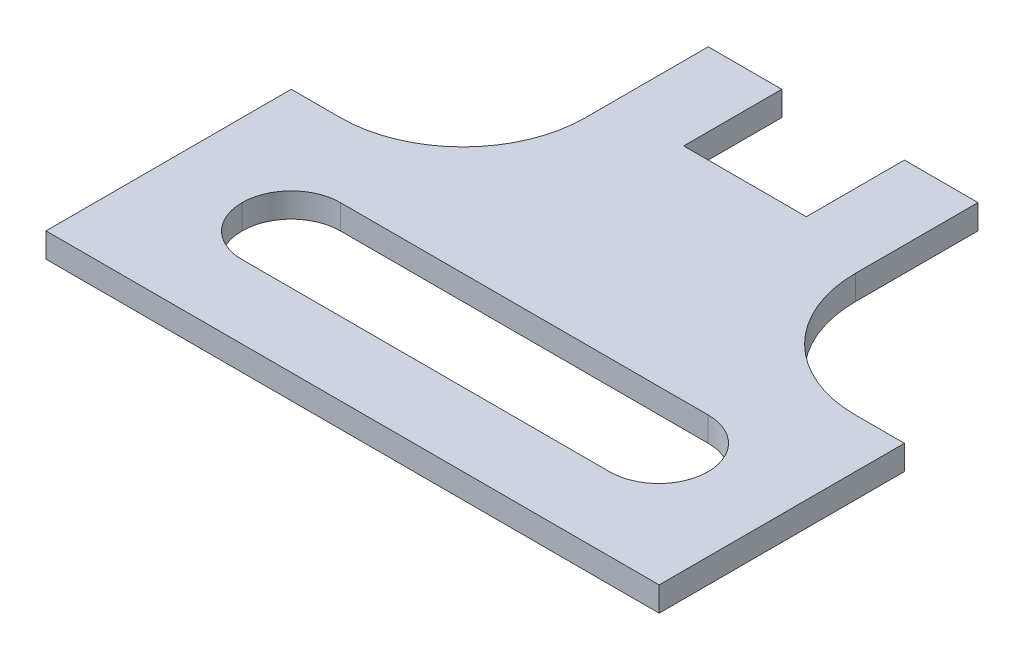
ISO-10303-21;
HEADER;
FILE_DESCRIPTION(('STEP AP214'),'2;1');
FILE_NAME('part.step','',(''),(''),'','','');
FILE_SCHEMA(('AUTOMOTIVE_DESIGN { 1 0 10303 214 1 1 1 1 }'));
ENDSEC;
DATA;
#1=APPLICATION_CONTEXT('core data for automotive mechanical design processes');
#2=APPLICATION_PROTOCOL_DEFINITION('international standard','automotive_design',2000,#1);
#3=PRODUCT_CONTEXT('',#1,'mechanical');
#4=PRODUCT('Part','Part','',(#3));
#5=PRODUCT_RELATED_PRODUCT_CATEGORY('part','',(#4));
#6=PRODUCT_DEFINITION_FORMATION('','',#4);
#7=PRODUCT_DEFINITION_CONTEXT('part definition',#1,'design');
#8=PRODUCT_DEFINITION('design','',#6,#7);
#9=PRODUCT_DEFINITION_SHAPE('','',#8);
#10=(LENGTH_UNIT() NAMED_UNIT(*) SI_UNIT(.MILLI.,.METRE.));
#11=(NAMED_UNIT(*) PLANE_ANGLE_UNIT() SI_UNIT($,.RADIAN.));
#12=(NAMED_UNIT(*) SI_UNIT($,.STERADIAN.) SOLID_ANGLE_UNIT());
#13=UNCERTAINTY_MEASURE_WITH_UNIT(LENGTH_MEASURE(1.E-05),#10,'distance_accuracy_value','');
#14=(GEOMETRIC_REPRESENTATION_CONTEXT(3) GLOBAL_UNCERTAINTY_ASSIGNED_CONTEXT((#13)) GLOBAL_UNIT_ASSIGNED_CONTEXT((#10,
#11,#12)) REPRESENTATION_CONTEXT('',''));
#15=CARTESIAN_POINT('',(0.,0.,0.));
#16=DIRECTION('',(0.,0.,1.));
#17=DIRECTION('',(1.,0.,0.));
#18=AXIS2_PLACEMENT_3D('',#15,#16,#17);
#19=CARTESIAN_POINT('',(15.1889778759943,1.,-5.6686795965745));
#20=DIRECTION('',(0.,1.,0.));
#21=DIRECTION('',(0.,0.,1.));
#22=AXIS2_PLACEMENT_3D('',#19,#20,#21);
#23=PLANE('',#22);
#24=DIRECTION('',(0.,0.,1.));
#25=VECTOR('',#24,1.);
#26=CARTESIAN_POINT('',(-7.81102212400571,1.,-0.6686795965745));
#27=LINE('',#26,#25);
#28=CARTESIAN_POINT('',(-7.81102212400571,1.,-0.6686795965745));
#29=VERTEX_POINT('',#28);
#30=CARTESIAN_POINT('',(-7.81102212400571,1.,9.3313204034255));
#31=VERTEX_POINT('',#30);
#32=EDGE_CURVE('E254',#29,#31,#27,.T.);
#33=ORIENTED_EDGE('',*,*,#32,.T.);
#34=DIRECTION('',(1.,0.,0.));
#35=VECTOR('',#34,1.);
#36=CARTESIAN_POINT('',(-7.81102212400571,1.,9.3313204034255));
#37=LINE('',#36,#35);
#38=CARTESIAN_POINT('',(17.1889778759943,1.,9.3313204034255));
#39=VERTEX_POINT('',#38);
#40=EDGE_CURVE('E258',#31,#39,#37,.T.);
#41=ORIENTED_EDGE('',*,*,#40,.T.);
#42=DIRECTION('',(0.,0.,-1.));
#43=VECTOR('',#42,1.);
#44=CARTESIAN_POINT('',(17.1889778759943,1.,-0.6686795965745));
#45=LINE('',#44,#43);
#46=CARTESIAN_POINT('',(17.1889778759943,1.,-0.6686795965745));
#47=VERTEX_POINT('',#46);
#48=EDGE_CURVE('E260',#39,#47,#45,.T.);
#49=ORIENTED_EDGE('',*,*,#48,.T.);
#50=DIRECTION('',(-1.,0.,0.));
#51=VECTOR('',#50,1.);
#52=CARTESIAN_POINT('',(15.1889778759943,1.,-0.6686795965745));
#53=LINE('',#52,#51);
#54=CARTESIAN_POINT('',(15.1889778759943,1.,-0.668679596574501));
#55=VERTEX_POINT('',#54);
#56=EDGE_CURVE('E263',#47,#55,#53,.T.);
#57=ORIENTED_EDGE('',*,*,#56,.T.);
#58=CARTESIAN_POINT('',(15.1889778759943,1.,-5.6686795965745));
#59=DIRECTION('',(0.,-1.,0.));
#60=DIRECTION('',(0.,0.,1.));
#61=AXIS2_PLACEMENT_3D('',#58,#59,#60);
#62=CIRCLE('',#61,5.);
#63=CARTESIAN_POINT('',(10.1889778759943,1.,-5.6686795965745));
#64=VERTEX_POINT('',#63);
#65=EDGE_CURVE('E261',#55,#64,#62,.T.);
#66=ORIENTED_EDGE('',*,*,#65,.T.);
#67=DIRECTION('',(0.,0.,-1.));
#68=VECTOR('',#67,1.);
#69=CARTESIAN_POINT('',(10.1889778759943,1.,-10.6686795965745));
#70=LINE('',#69,#68);
#71=CARTESIAN_POINT('',(10.1889778759943,1.,-10.6686795965745));
#72=VERTEX_POINT('',#71);
#73=EDGE_CURVE('E262',#64,#72,#70,.T.);
#74=ORIENTED_EDGE('',*,*,#73,.T.);
#75=DIRECTION('',(-1.,0.,0.));
#76=VECTOR('',#75,1.);
#77=CARTESIAN_POINT('',(7.18897787599429,1.,-10.6686795965745));
#78=LINE('',#77,#76);
#79=CARTESIAN_POINT('',(7.18897787599429,1.,-10.6686795965745));
#80=VERTEX_POINT('',#79);
#81=EDGE_CURVE('E270',#72,#80,#78,.T.);
#82=ORIENTED_EDGE('',*,*,#81,.T.);
#83=DIRECTION('',(0.,0.,1.));
#84=VECTOR('',#83,1.);
#85=CARTESIAN_POINT('',(7.18897787599429,1.,-6.6686795965745));
#86=LINE('',#85,#84);
#87=CARTESIAN_POINT('',(7.18897787599429,1.,-6.6686795965745));
#88=VERTEX_POINT('',#87);
#89=EDGE_CURVE('E267',#80,#88,#86,.T.);
#90=ORIENTED_EDGE('',*,*,#89,.T.);
#91=DIRECTION('',(-1.,0.,0.));
#92=VECTOR('',#91,1.);
#93=CARTESIAN_POINT('',(2.18897787599429,1.,-6.6686795965745));
#94=LINE('',#93,#92);
#95=CARTESIAN_POINT('',(2.18897787599429,1.,-6.6686795965745));
#96=VERTEX_POINT('',#95);
#97=EDGE_CURVE('E271',#88,#96,#94,.T.);
#98=ORIENTED_EDGE('',*,*,#97,.T.);
#99=DIRECTION('',(0.,0.,-1.));
#100=VECTOR('',#99,1.);
#101=CARTESIAN_POINT('',(2.18897787599429,1.,-10.6686795965745));
#102=LINE('',#101,#100);
#103=CARTESIAN_POINT('',(2.18897787599429,1.,-10.6686795965745));
#104=VERTEX_POINT('',#103);
#105=EDGE_CURVE('E273',#96,#104,#102,.T.);
#106=ORIENTED_EDGE('',*,*,#105,.T.);
#107=DIRECTION('',(-1.,0.,0.));
#108=VECTOR('',#107,1.);
#109=CARTESIAN_POINT('',(-0.811022124005715,1.,-10.6686795965745));
#110=LINE('',#109,#108);
#111=CARTESIAN_POINT('',(-0.811022124005715,1.,-10.6686795965745));
#112=VERTEX_POINT('',#111);
#113=EDGE_CURVE('E274',#104,#112,#110,.T.);
#114=ORIENTED_EDGE('',*,*,#113,.T.);
#115=DIRECTION('',(0.,0.,1.));
#116=VECTOR('',#115,1.);
#117=CARTESIAN_POINT('',(-0.811022124005714,1.,-5.6686795965745));
#118=LINE('',#117,#116);
#119=CARTESIAN_POINT('',(-0.811022124005714,1.,-5.6686795965745));
#120=VERTEX_POINT('',#119);
#121=EDGE_CURVE('E280',#112,#120,#118,.T.);
#122=ORIENTED_EDGE('',*,*,#121,.T.);
#123=CARTESIAN_POINT('',(-5.81102212400571,1.,-5.6686795965745));
#124=DIRECTION('',(0.,-1.,0.));
#125=DIRECTION('',(0.,0.,-1.));
#126=AXIS2_PLACEMENT_3D('',#123,#124,#125);
#127=CIRCLE('',#126,5.);
#128=CARTESIAN_POINT('',(-5.81102212400571,1.,-0.6686795965745));
#129=VERTEX_POINT('',#128);
#130=EDGE_CURVE('E278',#120,#129,#127,.T.);
#131=ORIENTED_EDGE('',*,*,#130,.T.);
#132=DIRECTION('',(-1.,0.,0.));
#133=VECTOR('',#132,1.);
#134=CARTESIAN_POINT('',(-7.81102212400571,1.,-0.6686795965745));
#135=LINE('',#134,#133);
#136=EDGE_CURVE('E282',#129,#29,#135,.T.);
#137=ORIENTED_EDGE('',*,*,#136,.T.);
#138=EDGE_LOOP('',(#33,#41,#49,#57,#66,#74,#82,#90,#98,#106,#114,#122,#131,#137));
#139=FACE_BOUND('',#138,.T.);
#140=DIRECTION('',(-1.1111675720499E-13,0.,-1.));
#141=VECTOR('',#140,1.);
#142=CARTESIAN_POINT('',(14.1889778759943,1.,4.3313204034255));
#143=LINE('',#142,#141);
#144=CARTESIAN_POINT('',(14.1889778759943,1.,4.34693212140226));
#145=VERTEX_POINT('',#144);
#146=CARTESIAN_POINT('',(14.1889778759943,1.,4.3313204034255));
#147=VERTEX_POINT('',#146);
#148=EDGE_CURVE('E196',#145,#147,#143,.T.);
#149=ORIENTED_EDGE('',*,*,#148,.F.);
#150=CARTESIAN_POINT('',(12.1889778759943,1.,4.34693212140226));
#151=DIRECTION('',(0.,1.,0.));
#152=DIRECTION('',(0.,0.,1.));
#153=AXIS2_PLACEMENT_3D('',#150,#151,#152);
#154=CIRCLE('',#153,2.);
#155=CARTESIAN_POINT('',(12.1889778759943,1.,6.34693212140226));
#156=VERTEX_POINT('',#155);
#157=EDGE_CURVE('E187',#156,#145,#154,.T.);
#158=ORIENTED_EDGE('',*,*,#157,.F.);
#159=DIRECTION('',(1.,0.,0.));
#160=VECTOR('',#159,1.);
#161=CARTESIAN_POINT('',(-2.81102212400572,1.,6.34693212140226));
#162=LINE('',#161,#160);
#163=CARTESIAN_POINT('',(-2.81102212400571,1.,6.34693212140226));
#164=VERTEX_POINT('',#163);
#165=EDGE_CURVE('E221',#164,#156,#162,.T.);
#166=ORIENTED_EDGE('',*,*,#165,.F.);
#167=CARTESIAN_POINT('',(-2.81102212400572,1.,4.34693212140226));
#168=DIRECTION('',(0.,1.,0.));
#169=DIRECTION('',(0.,0.,1.));
#170=AXIS2_PLACEMENT_3D('',#167,#168,#169);
#171=CIRCLE('',#170,2.);
#172=CARTESIAN_POINT('',(-4.81102212400571,1.,4.34693212140226));
#173=VERTEX_POINT('',#172);
#174=EDGE_CURVE('E219',#173,#164,#171,.T.);
#175=ORIENTED_EDGE('',*,*,#174,.F.);
#176=DIRECTION('',(0.,0.,1.));
#177=VECTOR('',#176,1.);
#178=CARTESIAN_POINT('',(-4.81102212400571,1.,4.3313204034255));
#179=LINE('',#178,#177);
#180=CARTESIAN_POINT('',(-4.81102212400571,1.,4.3313204034255));
#181=VERTEX_POINT('',#180);
#182=EDGE_CURVE('E220',#181,#173,#179,.T.);
#183=ORIENTED_EDGE('',*,*,#182,.F.);
#184=CARTESIAN_POINT('',(-2.81102212400571,1.,4.3313204034255));
#185=DIRECTION('',(0.,1.,0.));
#186=DIRECTION('',(0.,0.,1.));
#187=AXIS2_PLACEMENT_3D('',#184,#185,#186);
#188=CIRCLE('',#187,2.);
#189=CARTESIAN_POINT('',(-2.81102212400571,1.,2.3313204034255));
#190=VERTEX_POINT('',#189);
#191=EDGE_CURVE('E214',#190,#181,#188,.T.);
#192=ORIENTED_EDGE('',*,*,#191,.F.);
#193=DIRECTION('',(-1.,0.,0.));
#194=VECTOR('',#193,1.);
#195=CARTESIAN_POINT('',(-2.81102212400571,1.,2.3313204034255));
#196=LINE('',#195,#194);
#197=CARTESIAN_POINT('',(12.1889778759943,1.,2.3313204034255));
#198=VERTEX_POINT('',#197);
#199=EDGE_CURVE('E213',#198,#190,#196,.T.);
#200=ORIENTED_EDGE('',*,*,#199,.F.);
#201=CARTESIAN_POINT('',(12.1889778759943,1.,4.3313204034255));
#202=DIRECTION('',(0.,1.,0.));
#203=DIRECTION('',(0.,0.,-1.));
#204=AXIS2_PLACEMENT_3D('',#201,#202,#203);
#205=CIRCLE('',#204,2.);
#206=EDGE_CURVE('E208',#147,#198,#205,.T.);
#207=ORIENTED_EDGE('',*,*,#206,.F.);
#208=EDGE_LOOP('',(#149,#158,#166,#175,#183,#192,#200,#207));
#209=FACE_BOUND('',#208,.T.);
#210=ADVANCED_FACE('F39',(#139,#209),#23,.T.);
#211=CARTESIAN_POINT('',(15.1889778759943,0.,-5.6686795965745));
#212=DIRECTION('',(0.,1.,0.));
#213=DIRECTION('',(0.,0.,1.));
#214=AXIS2_PLACEMENT_3D('',#211,#212,#213);
#215=PLANE('',#214);
#216=DIRECTION('',(0.,0.,1.));
#217=VECTOR('',#216,1.);
#218=CARTESIAN_POINT('',(-7.81102212400571,0.,-0.6686795965745));
#219=LINE('',#218,#217);
#220=CARTESIAN_POINT('',(-7.81102212400571,0.,-0.6686795965745));
#221=VERTEX_POINT('',#220);
#222=CARTESIAN_POINT('',(-7.81102212400571,0.,9.3313204034255));
#223=VERTEX_POINT('',#222);
#224=EDGE_CURVE('E204',#221,#223,#219,.T.);
#225=ORIENTED_EDGE('',*,*,#224,.F.);
#226=DIRECTION('',(-1.,0.,0.));
#227=VECTOR('',#226,1.);
#228=CARTESIAN_POINT('',(-7.81102212400571,0.,-0.6686795965745));
#229=LINE('',#228,#227);
#230=CARTESIAN_POINT('',(-5.81102212400571,0.,-0.6686795965745));
#231=VERTEX_POINT('',#230);
#232=EDGE_CURVE('E257',#231,#221,#229,.T.);
#233=ORIENTED_EDGE('',*,*,#232,.F.);
#234=CARTESIAN_POINT('',(-5.81102212400571,0.,-5.6686795965745));
#235=DIRECTION('',(0.,-1.,0.));
#236=DIRECTION('',(0.,0.,-1.));
#237=AXIS2_PLACEMENT_3D('',#234,#235,#236);
#238=CIRCLE('',#237,5.);
#239=CARTESIAN_POINT('',(-0.811022124005714,0.,-5.6686795965745));
#240=VERTEX_POINT('',#239);
#241=EDGE_CURVE('E306',#240,#231,#238,.T.);
#242=ORIENTED_EDGE('',*,*,#241,.F.);
#243=DIRECTION('',(0.,0.,1.));
#244=VECTOR('',#243,1.);
#245=CARTESIAN_POINT('',(-0.811022124005714,0.,-5.6686795965745));
#246=LINE('',#245,#244);
#247=CARTESIAN_POINT('',(-0.811022124005715,0.,-10.6686795965745));
#248=VERTEX_POINT('',#247);
#249=EDGE_CURVE('E308',#248,#240,#246,.T.);
#250=ORIENTED_EDGE('',*,*,#249,.F.);
#251=DIRECTION('',(-1.,0.,0.));
#252=VECTOR('',#251,1.);
#253=CARTESIAN_POINT('',(-0.811022124005715,0.,-10.6686795965745));
#254=LINE('',#253,#252);
#255=CARTESIAN_POINT('',(2.18897787599429,0.,-10.6686795965745));
#256=VERTEX_POINT('',#255);
#257=EDGE_CURVE('E305',#256,#248,#254,.T.);
#258=ORIENTED_EDGE('',*,*,#257,.F.);
#259=DIRECTION('',(0.,0.,-1.));
#260=VECTOR('',#259,1.);
#261=CARTESIAN_POINT('',(2.18897787599429,0.,-10.6686795965745));
#262=LINE('',#261,#260);
#263=CARTESIAN_POINT('',(2.18897787599429,0.,-6.6686795965745));
#264=VERTEX_POINT('',#263);
#265=EDGE_CURVE('E302',#264,#256,#262,.T.);
#266=ORIENTED_EDGE('',*,*,#265,.F.);
#267=DIRECTION('',(-1.,0.,0.));
#268=VECTOR('',#267,1.);
#269=CARTESIAN_POINT('',(2.18897787599429,0.,-6.6686795965745));
#270=LINE('',#269,#268);
#271=CARTESIAN_POINT('',(7.18897787599429,0.,-6.6686795965745));
#272=VERTEX_POINT('',#271);
#273=EDGE_CURVE('E300',#272,#264,#270,.T.);
#274=ORIENTED_EDGE('',*,*,#273,.F.);
#275=DIRECTION('',(0.,0.,1.));
#276=VECTOR('',#275,1.);
#277=CARTESIAN_POINT('',(7.18897787599429,0.,-6.6686795965745));
#278=LINE('',#277,#276);
#279=CARTESIAN_POINT('',(7.18897787599429,0.,-10.6686795965745));
#280=VERTEX_POINT('',#279);
#281=EDGE_CURVE('E299',#280,#272,#278,.T.);
#282=ORIENTED_EDGE('',*,*,#281,.F.);
#283=DIRECTION('',(-1.,0.,0.));
#284=VECTOR('',#283,1.);
#285=CARTESIAN_POINT('',(7.18897787599429,0.,-10.6686795965745));
#286=LINE('',#285,#284);
#287=CARTESIAN_POINT('',(10.1889778759943,0.,-10.6686795965745));
#288=VERTEX_POINT('',#287);
#289=EDGE_CURVE('E296',#288,#280,#286,.T.);
#290=ORIENTED_EDGE('',*,*,#289,.F.);
#291=DIRECTION('',(0.,0.,-1.));
#292=VECTOR('',#291,1.);
#293=CARTESIAN_POINT('',(10.1889778759943,0.,-10.6686795965745));
#294=LINE('',#293,#292);
#295=CARTESIAN_POINT('',(10.1889778759943,0.,-5.6686795965745));
#296=VERTEX_POINT('',#295);
#297=EDGE_CURVE('E294',#296,#288,#294,.T.);
#298=ORIENTED_EDGE('',*,*,#297,.F.);
#299=CARTESIAN_POINT('',(15.1889778759943,0.,-5.6686795965745));
#300=DIRECTION('',(0.,-1.,0.));
#301=DIRECTION('',(0.,0.,1.));
#302=AXIS2_PLACEMENT_3D('',#299,#300,#301);
#303=CIRCLE('',#302,5.);
#304=CARTESIAN_POINT('',(15.1889778759943,0.,-0.668679596574501));
#305=VERTEX_POINT('',#304);
#306=EDGE_CURVE('E295',#305,#296,#303,.T.);
#307=ORIENTED_EDGE('',*,*,#306,.F.);
#308=DIRECTION('',(-1.,0.,0.));
#309=VECTOR('',#308,1.);
#310=CARTESIAN_POINT('',(15.1889778759943,0.,-0.6686795965745));
#311=LINE('',#310,#309);
#312=CARTESIAN_POINT('',(17.1889778759943,0.,-0.6686795965745));
#313=VERTEX_POINT('',#312);
#314=EDGE_CURVE('E290',#313,#305,#311,.T.);
#315=ORIENTED_EDGE('',*,*,#314,.F.);
#316=DIRECTION('',(0.,0.,-1.));
#317=VECTOR('',#316,1.);
#318=CARTESIAN_POINT('',(17.1889778759943,0.,-0.6686795965745));
#319=LINE('',#318,#317);
#320=CARTESIAN_POINT('',(17.1889778759943,0.,9.3313204034255));
#321=VERTEX_POINT('',#320);
#322=EDGE_CURVE('E289',#321,#313,#319,.T.);
#323=ORIENTED_EDGE('',*,*,#322,.F.);
#324=DIRECTION('',(1.,0.,0.));
#325=VECTOR('',#324,1.);
#326=CARTESIAN_POINT('',(-7.81102212400571,0.,9.3313204034255));
#327=LINE('',#326,#325);
#328=EDGE_CURVE('E286',#223,#321,#327,.T.);
#329=ORIENTED_EDGE('',*,*,#328,.F.);
#330=EDGE_LOOP('',(#225,#233,#242,#250,#258,#266,#274,#282,#290,#298,#307,#315,#323,#329));
#331=FACE_BOUND('',#330,.T.);
#332=CARTESIAN_POINT('',(12.1889778759943,0.,4.34693212140226));
#333=DIRECTION('',(0.,1.,0.));
#334=DIRECTION('',(0.,0.,1.));
#335=AXIS2_PLACEMENT_3D('',#332,#333,#334);
#336=CIRCLE('',#335,2.);
#337=CARTESIAN_POINT('',(12.1889778759943,0.,6.34693212140226));
#338=VERTEX_POINT('',#337);
#339=CARTESIAN_POINT('',(14.1889778759943,0.,4.34693212140226));
#340=VERTEX_POINT('',#339);
#341=EDGE_CURVE('E62',#338,#340,#336,.T.);
#342=ORIENTED_EDGE('',*,*,#341,.T.);
#343=DIRECTION('',(-1.1111675720499E-13,0.,-1.));
#344=VECTOR('',#343,1.);
#345=CARTESIAN_POINT('',(14.1889778759943,0.,4.3313204034255));
#346=LINE('',#345,#344);
#347=CARTESIAN_POINT('',(14.1889778759943,0.,4.3313204034255));
#348=VERTEX_POINT('',#347);
#349=EDGE_CURVE('E201',#340,#348,#346,.T.);
#350=ORIENTED_EDGE('',*,*,#349,.T.);
#351=CARTESIAN_POINT('',(12.1889778759943,0.,4.3313204034255));
#352=DIRECTION('',(0.,1.,0.));
#353=DIRECTION('',(0.,0.,-1.));
#354=AXIS2_PLACEMENT_3D('',#351,#352,#353);
#355=CIRCLE('',#354,2.);
#356=CARTESIAN_POINT('',(12.1889778759943,0.,2.3313204034255));
#357=VERTEX_POINT('',#356);
#358=EDGE_CURVE('E224',#348,#357,#355,.T.);
#359=ORIENTED_EDGE('',*,*,#358,.T.);
#360=DIRECTION('',(-1.,0.,0.));
#361=VECTOR('',#360,1.);
#362=CARTESIAN_POINT('',(-2.81102212400571,0.,2.3313204034255));
#363=LINE('',#362,#361);
#364=CARTESIAN_POINT('',(-2.81102212400571,0.,2.3313204034255));
#365=VERTEX_POINT('',#364);
#366=EDGE_CURVE('E228',#357,#365,#363,.T.);
#367=ORIENTED_EDGE('',*,*,#366,.T.);
#368=CARTESIAN_POINT('',(-2.81102212400571,0.,4.3313204034255));
#369=DIRECTION('',(0.,1.,0.));
#370=DIRECTION('',(0.,0.,1.));
#371=AXIS2_PLACEMENT_3D('',#368,#369,#370);
#372=CIRCLE('',#371,2.);
#373=CARTESIAN_POINT('',(-4.81102212400571,0.,4.3313204034255));
#374=VERTEX_POINT('',#373);
#375=EDGE_CURVE('E231',#365,#374,#372,.T.);
#376=ORIENTED_EDGE('',*,*,#375,.T.);
#377=DIRECTION('',(0.,0.,1.));
#378=VECTOR('',#377,1.);
#379=CARTESIAN_POINT('',(-4.81102212400571,0.,4.3313204034255));
#380=LINE('',#379,#378);
#381=CARTESIAN_POINT('',(-4.81102212400571,0.,4.34693212140226));
#382=VERTEX_POINT('',#381);
#383=EDGE_CURVE('E233',#374,#382,#380,.T.);
#384=ORIENTED_EDGE('',*,*,#383,.T.);
#385=CARTESIAN_POINT('',(-2.81102212400572,0.,4.34693212140226));
#386=DIRECTION('',(0.,1.,0.));
#387=DIRECTION('',(0.,0.,1.));
#388=AXIS2_PLACEMENT_3D('',#385,#386,#387);
#389=CIRCLE('',#388,2.);
#390=CARTESIAN_POINT('',(-2.81102212400572,0.,6.34693212140226));
#391=VERTEX_POINT('',#390);
#392=EDGE_CURVE('E240',#382,#391,#389,.T.);
#393=ORIENTED_EDGE('',*,*,#392,.T.);
#394=DIRECTION('',(1.,0.,0.));
#395=VECTOR('',#394,1.);
#396=CARTESIAN_POINT('',(-2.81102212400572,0.,6.34693212140226));
#397=LINE('',#396,#395);
#398=EDGE_CURVE('E197',#391,#338,#397,.T.);
#399=ORIENTED_EDGE('',*,*,#398,.T.);
#400=EDGE_LOOP('',(#342,#350,#359,#367,#376,#384,#393,#399));
#401=FACE_BOUND('',#400,.T.);
#402=ADVANCED_FACE('F356',(#331,#401),#215,.F.);
#403=CARTESIAN_POINT('',(-7.81102212400571,1.,-0.6686795965745));
#404=DIRECTION('',(1.,0.,0.));
#405=DIRECTION('',(0.,0.,-1.));
#406=AXIS2_PLACEMENT_3D('',#403,#404,#405);
#407=PLANE('',#406);
#408=ORIENTED_EDGE('',*,*,#224,.T.);
#409=DIRECTION('',(0.,-1.,0.));
#410=VECTOR('',#409,1.);
#411=CARTESIAN_POINT('',(-7.81102212400571,1.,9.3313204034255));
#412=LINE('',#411,#410);
#413=EDGE_CURVE('E11',#31,#223,#412,.T.);
#414=ORIENTED_EDGE('',*,*,#413,.F.);
#415=ORIENTED_EDGE('',*,*,#32,.F.);
#416=DIRECTION('',(0.,-1.,0.));
#417=VECTOR('',#416,1.);
#418=CARTESIAN_POINT('',(-7.81102212400571,1.,-0.6686795965745));
#419=LINE('',#418,#417);
#420=EDGE_CURVE('E284',#29,#221,#419,.T.);
#421=ORIENTED_EDGE('',*,*,#420,.T.);
#422=EDGE_LOOP('',(#408,#414,#415,#421));
#423=FACE_BOUND('',#422,.T.);
#424=ADVANCED_FACE('F41',(#423),#407,.F.);
#425=CARTESIAN_POINT('',(-7.81102212400571,1.,9.3313204034255));
#426=DIRECTION('',(0.,0.,-1.));
#427=DIRECTION('',(-1.,0.,0.));
#428=AXIS2_PLACEMENT_3D('',#425,#426,#427);
#429=PLANE('',#428);
#430=ORIENTED_EDGE('',*,*,#328,.T.);
#431=DIRECTION('',(0.,-1.,0.));
#432=VECTOR('',#431,1.);
#433=CARTESIAN_POINT('',(17.1889778759943,1.,9.3313204034255));
#434=LINE('',#433,#432);
#435=EDGE_CURVE('E50',#39,#321,#434,.T.);
#436=ORIENTED_EDGE('',*,*,#435,.F.);
#437=ORIENTED_EDGE('',*,*,#40,.F.);
#438=ORIENTED_EDGE('',*,*,#413,.T.);
#439=EDGE_LOOP('',(#430,#436,#437,#438));
#440=FACE_BOUND('',#439,.T.);
#441=ADVANCED_FACE('F374',(#440),#429,.F.);
#442=CARTESIAN_POINT('',(17.1889778759943,1.,-0.6686795965745));
#443=DIRECTION('',(-1.,0.,0.));
#444=DIRECTION('',(0.,0.,1.));
#445=AXIS2_PLACEMENT_3D('',#442,#443,#444);
#446=PLANE('',#445);
#447=ORIENTED_EDGE('',*,*,#322,.T.);
#448=DIRECTION('',(0.,-1.,0.));
#449=VECTOR('',#448,1.);
#450=CARTESIAN_POINT('',(17.1889778759943,1.,-0.6686795965745));
#451=LINE('',#450,#449);
#452=EDGE_CURVE('E344',#47,#313,#451,.T.);
#453=ORIENTED_EDGE('',*,*,#452,.F.);
#454=ORIENTED_EDGE('',*,*,#48,.F.);
#455=ORIENTED_EDGE('',*,*,#435,.T.);
#456=EDGE_LOOP('',(#447,#453,#454,#455));
#457=FACE_BOUND('',#456,.T.);
#458=ADVANCED_FACE('F349',(#457),#446,.F.);
#459=CARTESIAN_POINT('',(15.1889778759943,1.,-0.6686795965745));
#460=DIRECTION('',(0.,0.,1.));
#461=DIRECTION('',(1.,0.,0.));
#462=AXIS2_PLACEMENT_3D('',#459,#460,#461);
#463=PLANE('',#462);
#464=ORIENTED_EDGE('',*,*,#314,.T.);
#465=DIRECTION('',(0.,-1.,0.));
#466=VECTOR('',#465,1.);
#467=CARTESIAN_POINT('',(15.1889778759943,1.,-0.668679596574501));
#468=LINE('',#467,#466);
#469=EDGE_CURVE('E338',#55,#305,#468,.T.);
#470=ORIENTED_EDGE('',*,*,#469,.F.);
#471=ORIENTED_EDGE('',*,*,#56,.F.);
#472=ORIENTED_EDGE('',*,*,#452,.T.);
#473=EDGE_LOOP('',(#464,#470,#471,#472));
#474=FACE_BOUND('',#473,.T.);
#475=ADVANCED_FACE('F365',(#474),#463,.F.);
#476=CARTESIAN_POINT('',(15.1889778759943,1.,-5.6686795965745));
#477=DIRECTION('',(0.,-1.,0.));
#478=DIRECTION('',(0.,0.,-1.));
#479=AXIS2_PLACEMENT_3D('',#476,#477,#478);
#480=CYLINDRICAL_SURFACE('',#479,5.);
#481=ORIENTED_EDGE('',*,*,#306,.T.);
#482=DIRECTION('',(0.,-1.,0.));
#483=VECTOR('',#482,1.);
#484=CARTESIAN_POINT('',(10.1889778759943,1.,-5.6686795965745));
#485=LINE('',#484,#483);
#486=EDGE_CURVE('E340',#64,#296,#485,.T.);
#487=ORIENTED_EDGE('',*,*,#486,.F.);
#488=ORIENTED_EDGE('',*,*,#65,.F.);
#489=ORIENTED_EDGE('',*,*,#469,.T.);
#490=EDGE_LOOP('',(#481,#487,#488,#489));
#491=FACE_BOUND('',#490,.T.);
#492=ADVANCED_FACE('F366',(#491),#480,.F.);
#493=CARTESIAN_POINT('',(10.1889778759943,1.,-10.6686795965745));
#494=DIRECTION('',(-1.,0.,0.));
#495=DIRECTION('',(0.,0.,1.));
#496=AXIS2_PLACEMENT_3D('',#493,#494,#495);
#497=PLANE('',#496);
#498=ORIENTED_EDGE('',*,*,#297,.T.);
#499=DIRECTION('',(0.,-1.,0.));
#500=VECTOR('',#499,1.);
#501=CARTESIAN_POINT('',(10.1889778759943,1.,-10.6686795965745));
#502=LINE('',#501,#500);
#503=EDGE_CURVE('E333',#72,#288,#502,.T.);
#504=ORIENTED_EDGE('',*,*,#503,.F.);
#505=ORIENTED_EDGE('',*,*,#73,.F.);
#506=ORIENTED_EDGE('',*,*,#486,.T.);
#507=EDGE_LOOP('',(#498,#504,#505,#506));
#508=FACE_BOUND('',#507,.T.);
#509=ADVANCED_FACE('F417',(#508),#497,.F.);
#510=CARTESIAN_POINT('',(7.18897787599429,1.,-10.6686795965745));
#511=DIRECTION('',(0.,0.,1.));
#512=DIRECTION('',(1.,0.,0.));
#513=AXIS2_PLACEMENT_3D('',#510,#511,#512);
#514=PLANE('',#513);
#515=ORIENTED_EDGE('',*,*,#289,.T.);
#516=DIRECTION('',(0.,-1.,0.));
#517=VECTOR('',#516,1.);
#518=CARTESIAN_POINT('',(7.18897787599429,1.,-10.6686795965745));
#519=LINE('',#518,#517);
#520=EDGE_CURVE('E331',#80,#280,#519,.T.);
#521=ORIENTED_EDGE('',*,*,#520,.F.);
#522=ORIENTED_EDGE('',*,*,#81,.F.);
#523=ORIENTED_EDGE('',*,*,#503,.T.);
#524=EDGE_LOOP('',(#515,#521,#522,#523));
#525=FACE_BOUND('',#524,.T.);
#526=ADVANCED_FACE('F413',(#525),#514,.F.);
#527=CARTESIAN_POINT('',(7.18897787599429,1.,-6.6686795965745));
#528=DIRECTION('',(1.,0.,0.));
#529=DIRECTION('',(0.,0.,-1.));
#530=AXIS2_PLACEMENT_3D('',#527,#528,#529);
#531=PLANE('',#530);
#532=ORIENTED_EDGE('',*,*,#281,.T.);
#533=DIRECTION('',(0.,-1.,0.));
#534=VECTOR('',#533,1.);
#535=CARTESIAN_POINT('',(7.18897787599429,1.,-6.6686795965745));
#536=LINE('',#535,#534);
#537=EDGE_CURVE('E329',#88,#272,#536,.T.);
#538=ORIENTED_EDGE('',*,*,#537,.F.);
#539=ORIENTED_EDGE('',*,*,#89,.F.);
#540=ORIENTED_EDGE('',*,*,#520,.T.);
#541=EDGE_LOOP('',(#532,#538,#539,#540));
#542=FACE_BOUND('',#541,.T.);
#543=ADVANCED_FACE('F407',(#542),#531,.F.);
#544=CARTESIAN_POINT('',(2.18897787599429,1.,-6.6686795965745));
#545=DIRECTION('',(0.,0.,1.));
#546=DIRECTION('',(1.,0.,0.));
#547=AXIS2_PLACEMENT_3D('',#544,#545,#546);
#548=PLANE('',#547);
#549=ORIENTED_EDGE('',*,*,#273,.T.);
#550=DIRECTION('',(0.,-1.,0.));
#551=VECTOR('',#550,1.);
#552=CARTESIAN_POINT('',(2.18897787599429,1.,-6.6686795965745));
#553=LINE('',#552,#551);
#554=EDGE_CURVE('E324',#96,#264,#553,.T.);
#555=ORIENTED_EDGE('',*,*,#554,.F.);
#556=ORIENTED_EDGE('',*,*,#97,.F.);
#557=ORIENTED_EDGE('',*,*,#537,.T.);
#558=EDGE_LOOP('',(#549,#555,#556,#557));
#559=FACE_BOUND('',#558,.T.);
#560=ADVANCED_FACE('F402',(#559),#548,.F.);
#561=CARTESIAN_POINT('',(2.18897787599429,1.,-10.6686795965745));
#562=DIRECTION('',(-1.,0.,0.));
#563=DIRECTION('',(0.,0.,1.));
#564=AXIS2_PLACEMENT_3D('',#561,#562,#563);
#565=PLANE('',#564);
#566=ORIENTED_EDGE('',*,*,#265,.T.);
#567=DIRECTION('',(0.,-1.,0.));
#568=VECTOR('',#567,1.);
#569=CARTESIAN_POINT('',(2.18897787599429,1.,-10.6686795965745));
#570=LINE('',#569,#568);
#571=EDGE_CURVE('E325',#104,#256,#570,.T.);
#572=ORIENTED_EDGE('',*,*,#571,.F.);
#573=ORIENTED_EDGE('',*,*,#105,.F.);
#574=ORIENTED_EDGE('',*,*,#554,.T.);
#575=EDGE_LOOP('',(#566,#572,#573,#574));
#576=FACE_BOUND('',#575,.T.);
#577=ADVANCED_FACE('F397',(#576),#565,.F.);
#578=CARTESIAN_POINT('',(-0.811022124005715,1.,-10.6686795965745));
#579=DIRECTION('',(0.,0.,1.));
#580=DIRECTION('',(1.,0.,0.));
#581=AXIS2_PLACEMENT_3D('',#578,#579,#580);
#582=PLANE('',#581);
#583=ORIENTED_EDGE('',*,*,#257,.T.);
#584=DIRECTION('',(0.,-1.,0.));
#585=VECTOR('',#584,1.);
#586=CARTESIAN_POINT('',(-0.811022124005715,1.,-10.6686795965745));
#587=LINE('',#586,#585);
#588=EDGE_CURVE('E317',#112,#248,#587,.T.);
#589=ORIENTED_EDGE('',*,*,#588,.F.);
#590=ORIENTED_EDGE('',*,*,#113,.F.);
#591=ORIENTED_EDGE('',*,*,#571,.T.);
#592=EDGE_LOOP('',(#583,#589,#590,#591));
#593=FACE_BOUND('',#592,.T.);
#594=ADVANCED_FACE('F394',(#593),#582,.F.);
#595=CARTESIAN_POINT('',(-0.811022124005714,1.,-5.6686795965745));
#596=DIRECTION('',(1.,0.,0.));
#597=DIRECTION('',(0.,0.,-1.));
#598=AXIS2_PLACEMENT_3D('',#595,#596,#597);
#599=PLANE('',#598);
#600=ORIENTED_EDGE('',*,*,#249,.T.);
#601=DIRECTION('',(0.,-1.,0.));
#602=VECTOR('',#601,1.);
#603=CARTESIAN_POINT('',(-0.811022124005714,1.,-5.6686795965745));
#604=LINE('',#603,#602);
#605=EDGE_CURVE('E316',#120,#240,#604,.T.);
#606=ORIENTED_EDGE('',*,*,#605,.F.);
#607=ORIENTED_EDGE('',*,*,#121,.F.);
#608=ORIENTED_EDGE('',*,*,#588,.T.);
#609=EDGE_LOOP('',(#600,#606,#607,#608));
#610=FACE_BOUND('',#609,.T.);
#611=ADVANCED_FACE('F388',(#610),#599,.F.);
#612=CARTESIAN_POINT('',(-5.81102212400571,1.,-5.6686795965745));
#613=DIRECTION('',(0.,-1.,0.));
#614=DIRECTION('',(0.,0.,-1.));
#615=AXIS2_PLACEMENT_3D('',#612,#613,#614);
#616=CYLINDRICAL_SURFACE('',#615,5.);
#617=ORIENTED_EDGE('',*,*,#241,.T.);
#618=DIRECTION('',(0.,-1.,0.));
#619=VECTOR('',#618,1.);
#620=CARTESIAN_POINT('',(-5.81102212400571,1.,-0.6686795965745));
#621=LINE('',#620,#619);
#622=EDGE_CURVE('E313',#129,#231,#621,.T.);
#623=ORIENTED_EDGE('',*,*,#622,.F.);
#624=ORIENTED_EDGE('',*,*,#130,.F.);
#625=ORIENTED_EDGE('',*,*,#605,.T.);
#626=EDGE_LOOP('',(#617,#623,#624,#625));
#627=FACE_BOUND('',#626,.T.);
#628=ADVANCED_FACE('F383',(#627),#616,.F.);
#629=CARTESIAN_POINT('',(-7.81102212400571,1.,-0.6686795965745));
#630=DIRECTION('',(0.,0.,1.));
#631=DIRECTION('',(1.,0.,0.));
#632=AXIS2_PLACEMENT_3D('',#629,#630,#631);
#633=PLANE('',#632);
#634=ORIENTED_EDGE('',*,*,#232,.T.);
#635=ORIENTED_EDGE('',*,*,#420,.F.);
#636=ORIENTED_EDGE('',*,*,#136,.F.);
#637=ORIENTED_EDGE('',*,*,#622,.T.);
#638=EDGE_LOOP('',(#634,#635,#636,#637));
#639=FACE_BOUND('',#638,.T.);
#640=ADVANCED_FACE('F380',(#639),#633,.F.);
#641=CARTESIAN_POINT('',(12.1889778759943,1.,4.34693212140226));
#642=DIRECTION('',(0.,-1.,0.));
#643=DIRECTION('',(0.,0.,-1.));
#644=AXIS2_PLACEMENT_3D('',#641,#642,#643);
#645=CYLINDRICAL_SURFACE('',#644,2.);
#646=ORIENTED_EDGE('',*,*,#341,.F.);
#647=DIRECTION('',(0.,-1.,0.));
#648=VECTOR('',#647,1.);
#649=CARTESIAN_POINT('',(12.1889778759943,1.,6.34693212140226));
#650=LINE('',#649,#648);
#651=EDGE_CURVE('E195',#156,#338,#650,.T.);
#652=ORIENTED_EDGE('',*,*,#651,.F.);
#653=ORIENTED_EDGE('',*,*,#157,.T.);
#654=DIRECTION('',(0.,-1.,0.));
#655=VECTOR('',#654,1.);
#656=CARTESIAN_POINT('',(14.1889778759943,1.,4.34693212140226));
#657=LINE('',#656,#655);
#658=EDGE_CURVE('E192',#145,#340,#657,.T.);
#659=ORIENTED_EDGE('',*,*,#658,.T.);
#660=EDGE_LOOP('',(#646,#652,#653,#659));
#661=FACE_BOUND('',#660,.T.);
#662=ADVANCED_FACE('F189',(#661),#645,.F.);
#663=CARTESIAN_POINT('',(14.1889778759943,1.,4.3313204034255));
#664=DIRECTION('',(-1.,0.,1.1111675720499E-13));
#665=DIRECTION('',(1.1111675720499E-13,0.,1.));
#666=AXIS2_PLACEMENT_3D('',#663,#664,#665);
#667=PLANE('',#666);
#668=ORIENTED_EDGE('',*,*,#349,.F.);
#669=ORIENTED_EDGE('',*,*,#658,.F.);
#670=ORIENTED_EDGE('',*,*,#148,.T.);
#671=DIRECTION('',(0.,-1.,0.));
#672=VECTOR('',#671,1.);
#673=CARTESIAN_POINT('',(14.1889778759943,1.,4.3313204034255));
#674=LINE('',#673,#672);
#675=EDGE_CURVE('E203',#147,#348,#674,.T.);
#676=ORIENTED_EDGE('',*,*,#675,.T.);
#677=EDGE_LOOP('',(#668,#669,#670,#676));
#678=FACE_BOUND('',#677,.T.);
#679=ADVANCED_FACE('F200',(#678),#667,.T.);
#680=CARTESIAN_POINT('',(12.1889778759943,1.,4.3313204034255));
#681=DIRECTION('',(0.,-1.,0.));
#682=DIRECTION('',(0.,0.,-1.));
#683=AXIS2_PLACEMENT_3D('',#680,#681,#682);
#684=CYLINDRICAL_SURFACE('',#683,2.);
#685=ORIENTED_EDGE('',*,*,#358,.F.);
#686=ORIENTED_EDGE('',*,*,#675,.F.);
#687=ORIENTED_EDGE('',*,*,#206,.T.);
#688=DIRECTION('',(0.,-1.,0.));
#689=VECTOR('',#688,1.);
#690=CARTESIAN_POINT('',(12.1889778759943,1.,2.3313204034255));
#691=LINE('',#690,#689);
#692=EDGE_CURVE('E248',#198,#357,#691,.T.);
#693=ORIENTED_EDGE('',*,*,#692,.T.);
#694=EDGE_LOOP('',(#685,#686,#687,#693));
#695=FACE_BOUND('',#694,.T.);
#696=ADVANCED_FACE('F492',(#695),#684,.F.);
#697=CARTESIAN_POINT('',(-2.81102212400571,1.,2.3313204034255));
#698=DIRECTION('',(0.,0.,1.));
#699=DIRECTION('',(1.,0.,0.));
#700=AXIS2_PLACEMENT_3D('',#697,#698,#699);
#701=PLANE('',#700);
#702=ORIENTED_EDGE('',*,*,#366,.F.);
#703=ORIENTED_EDGE('',*,*,#692,.F.);
#704=ORIENTED_EDGE('',*,*,#199,.T.);
#705=DIRECTION('',(0.,-1.,0.));
#706=VECTOR('',#705,1.);
#707=CARTESIAN_POINT('',(-2.81102212400571,1.,2.3313204034255));
#708=LINE('',#707,#706);
#709=EDGE_CURVE('E246',#190,#365,#708,.T.);
#710=ORIENTED_EDGE('',*,*,#709,.T.);
#711=EDGE_LOOP('',(#702,#703,#704,#710));
#712=FACE_BOUND('',#711,.T.);
#713=ADVANCED_FACE('F501',(#712),#701,.T.);
#714=CARTESIAN_POINT('',(-2.81102212400571,1.,4.3313204034255));
#715=DIRECTION('',(0.,-1.,0.));
#716=DIRECTION('',(0.,0.,-1.));
#717=AXIS2_PLACEMENT_3D('',#714,#715,#716);
#718=CYLINDRICAL_SURFACE('',#717,2.);
#719=ORIENTED_EDGE('',*,*,#375,.F.);
#720=ORIENTED_EDGE('',*,*,#709,.F.);
#721=ORIENTED_EDGE('',*,*,#191,.T.);
#722=DIRECTION('',(0.,-1.,0.));
#723=VECTOR('',#722,1.);
#724=CARTESIAN_POINT('',(-4.81102212400571,1.,4.3313204034255));
#725=LINE('',#724,#723);
#726=EDGE_CURVE('E247',#181,#374,#725,.T.);
#727=ORIENTED_EDGE('',*,*,#726,.T.);
#728=EDGE_LOOP('',(#719,#720,#721,#727));
#729=FACE_BOUND('',#728,.T.);
#730=ADVANCED_FACE('F508',(#729),#718,.F.);
#731=CARTESIAN_POINT('',(-4.81102212400571,1.,4.3313204034255));
#732=DIRECTION('',(1.,0.,0.));
#733=DIRECTION('',(0.,0.,-1.));
#734=AXIS2_PLACEMENT_3D('',#731,#732,#733);
#735=PLANE('',#734);
#736=ORIENTED_EDGE('',*,*,#383,.F.);
#737=ORIENTED_EDGE('',*,*,#726,.F.);
#738=ORIENTED_EDGE('',*,*,#182,.T.);
#739=DIRECTION('',(0.,-1.,0.));
#740=VECTOR('',#739,1.);
#741=CARTESIAN_POINT('',(-4.81102212400571,1.,4.34693212140226));
#742=LINE('',#741,#740);
#743=EDGE_CURVE('E243',#173,#382,#742,.T.);
#744=ORIENTED_EDGE('',*,*,#743,.T.);
#745=EDGE_LOOP('',(#736,#737,#738,#744));
#746=FACE_BOUND('',#745,.T.);
#747=ADVANCED_FACE('F519',(#746),#735,.T.);
#748=CARTESIAN_POINT('',(-2.81102212400572,1.,4.34693212140226));
#749=DIRECTION('',(0.,-1.,0.));
#750=DIRECTION('',(0.,0.,-1.));
#751=AXIS2_PLACEMENT_3D('',#748,#749,#750);
#752=CYLINDRICAL_SURFACE('',#751,2.);
#753=ORIENTED_EDGE('',*,*,#392,.F.);
#754=ORIENTED_EDGE('',*,*,#743,.F.);
#755=ORIENTED_EDGE('',*,*,#174,.T.);
#756=DIRECTION('',(0.,-1.,0.));
#757=VECTOR('',#756,1.);
#758=CARTESIAN_POINT('',(-2.81102212400572,1.,6.34693212140226));
#759=LINE('',#758,#757);
#760=EDGE_CURVE('E53',#164,#391,#759,.T.);
#761=ORIENTED_EDGE('',*,*,#760,.T.);
#762=EDGE_LOOP('',(#753,#754,#755,#761));
#763=FACE_BOUND('',#762,.T.);
#764=ADVANCED_FACE('F526',(#763),#752,.F.);
#765=CARTESIAN_POINT('',(-2.81102212400572,1.,6.34693212140226));
#766=DIRECTION('',(0.,0.,-1.));
#767=DIRECTION('',(-1.,0.,0.));
#768=AXIS2_PLACEMENT_3D('',#765,#766,#767);
#769=PLANE('',#768);
#770=ORIENTED_EDGE('',*,*,#398,.F.);
#771=ORIENTED_EDGE('',*,*,#760,.F.);
#772=ORIENTED_EDGE('',*,*,#165,.T.);
#773=ORIENTED_EDGE('',*,*,#651,.T.);
#774=EDGE_LOOP('',(#770,#771,#772,#773));
#775=FACE_BOUND('',#774,.T.);
#776=ADVANCED_FACE('F540',(#775),#769,.T.);
#777=CLOSED_SHELL('',(#210,#402,#424,#441,#458,#475,#492,#509,#526,#543,#560,#577,#594,#611,
#628,#640,#662,#679,#696,#713,#730,#747,#764,#776));
#778=MANIFOLD_SOLID_BREP('B2',#777);
#779=ADVANCED_BREP_SHAPE_REPRESENTATION('',(#18,#778),#14);
#780=SHAPE_DEFINITION_REPRESENTATION(#9,#779);
ENDSEC;
END-ISO-10303-21;
